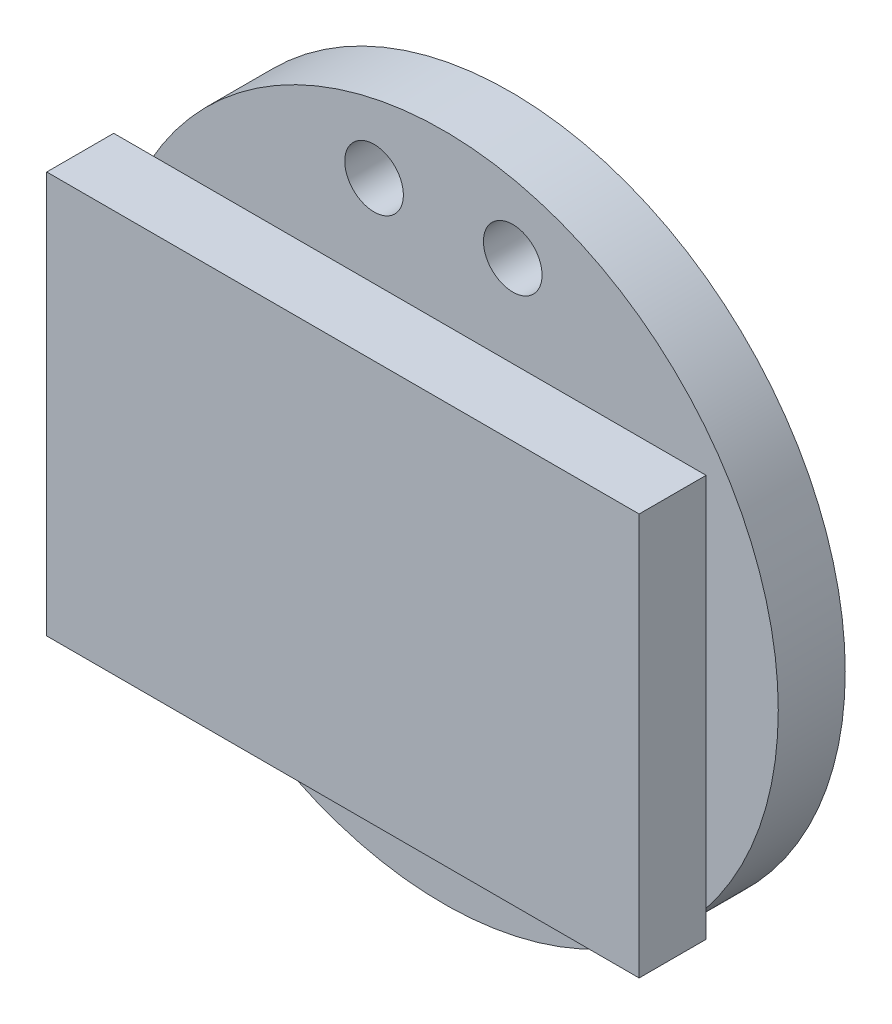
ISO-10303-21;
HEADER;
FILE_DESCRIPTION(('STEP AP214'),'2;1');
FILE_NAME('part.step','',(''),(''),'','','');
FILE_SCHEMA(('AUTOMOTIVE_DESIGN { 1 0 10303 214 1 1 1 1 }'));
ENDSEC;
DATA;
#1=APPLICATION_CONTEXT('core data for automotive mechanical design processes');
#2=APPLICATION_PROTOCOL_DEFINITION('international standard','automotive_design',2000,#1);
#3=PRODUCT_CONTEXT('',#1,'mechanical');
#4=PRODUCT('Part','Part','',(#3));
#5=PRODUCT_RELATED_PRODUCT_CATEGORY('part','',(#4));
#6=PRODUCT_DEFINITION_FORMATION('','',#4);
#7=PRODUCT_DEFINITION_CONTEXT('part definition',#1,'design');
#8=PRODUCT_DEFINITION('design','',#6,#7);
#9=PRODUCT_DEFINITION_SHAPE('','',#8);
#10=(LENGTH_UNIT() NAMED_UNIT(*) SI_UNIT(.MILLI.,.METRE.));
#11=(NAMED_UNIT(*) PLANE_ANGLE_UNIT() SI_UNIT($,.RADIAN.));
#12=(NAMED_UNIT(*) SI_UNIT($,.STERADIAN.) SOLID_ANGLE_UNIT());
#13=UNCERTAINTY_MEASURE_WITH_UNIT(LENGTH_MEASURE(1.E-05),#10,'distance_accuracy_value','');
#14=(GEOMETRIC_REPRESENTATION_CONTEXT(3) GLOBAL_UNCERTAINTY_ASSIGNED_CONTEXT((#13)) GLOBAL_UNIT_ASSIGNED_CONTEXT((#10,
#11,#12)) REPRESENTATION_CONTEXT('',''));
#15=CARTESIAN_POINT('',(0.,0.,0.));
#16=DIRECTION('',(0.,0.,1.));
#17=DIRECTION('',(1.,0.,0.));
#18=AXIS2_PLACEMENT_3D('',#15,#16,#17);
#19=CARTESIAN_POINT('',(0.,0.,-4.));
#20=DIRECTION('',(1.,0.,0.));
#21=DIRECTION('',(0.,0.,1.));
#22=AXIS2_PLACEMENT_3D('',#19,#20,#21);
#23=PLANE('',#22);
#24=DIRECTION('',(0.,-1.,0.));
#25=VECTOR('',#24,1.);
#26=CARTESIAN_POINT('',(0.,0.,0.));
#27=LINE('',#26,#25);
#28=CARTESIAN_POINT('',(0.,0.,0.));
#29=VERTEX_POINT('',#28);
#30=CARTESIAN_POINT('',(0.,-24.,0.));
#31=VERTEX_POINT('',#30);
#32=EDGE_CURVE('E103',#29,#31,#27,.T.);
#33=ORIENTED_EDGE('',*,*,#32,.F.);
#34=DIRECTION('',(0.,0.,1.));
#35=VECTOR('',#34,1.);
#36=CARTESIAN_POINT('',(0.,0.,-4.));
#37=LINE('',#36,#35);
#38=CARTESIAN_POINT('',(0.,0.,-4.));
#39=VERTEX_POINT('',#38);
#40=EDGE_CURVE('E102',#39,#29,#37,.T.);
#41=ORIENTED_EDGE('',*,*,#40,.F.);
#42=DIRECTION('',(0.,-1.,0.));
#43=VECTOR('',#42,1.);
#44=CARTESIAN_POINT('',(0.,0.,-4.));
#45=LINE('',#44,#43);
#46=CARTESIAN_POINT('',(0.,-24.,-4.));
#47=VERTEX_POINT('',#46);
#48=EDGE_CURVE('E97',#39,#47,#45,.T.);
#49=ORIENTED_EDGE('',*,*,#48,.T.);
#50=DIRECTION('',(0.,0.,1.));
#51=VECTOR('',#50,1.);
#52=CARTESIAN_POINT('',(0.,-24.,-4.));
#53=LINE('',#52,#51);
#54=EDGE_CURVE('E40',#47,#31,#53,.T.);
#55=ORIENTED_EDGE('',*,*,#54,.T.);
#56=EDGE_LOOP('',(#33,#41,#49,#55));
#57=FACE_BOUND('',#56,.T.);
#58=ADVANCED_FACE('F37',(#57),#23,.F.);
#59=CARTESIAN_POINT('',(0.,-24.,-4.));
#60=DIRECTION('',(0.,1.,0.));
#61=DIRECTION('',(0.,0.,-1.));
#62=AXIS2_PLACEMENT_3D('',#59,#60,#61);
#63=PLANE('',#62);
#64=DIRECTION('',(1.,0.,0.));
#65=VECTOR('',#64,1.);
#66=CARTESIAN_POINT('',(0.,-24.,0.));
#67=LINE('',#66,#65);
#68=CARTESIAN_POINT('',(35.38,-24.,0.));
#69=VERTEX_POINT('',#68);
#70=EDGE_CURVE('E105',#31,#69,#67,.T.);
#71=ORIENTED_EDGE('',*,*,#70,.F.);
#72=ORIENTED_EDGE('',*,*,#54,.F.);
#73=DIRECTION('',(1.,0.,0.));
#74=VECTOR('',#73,1.);
#75=CARTESIAN_POINT('',(0.,-24.,-4.));
#76=LINE('',#75,#74);
#77=CARTESIAN_POINT('',(35.38,-24.,-4.));
#78=VERTEX_POINT('',#77);
#79=EDGE_CURVE('E79',#47,#78,#76,.T.);
#80=ORIENTED_EDGE('',*,*,#79,.T.);
#81=DIRECTION('',(0.,0.,1.));
#82=VECTOR('',#81,1.);
#83=CARTESIAN_POINT('',(35.38,-24.,-4.));
#84=LINE('',#83,#82);
#85=EDGE_CURVE('E88',#78,#69,#84,.T.);
#86=ORIENTED_EDGE('',*,*,#85,.T.);
#87=EDGE_LOOP('',(#71,#72,#80,#86));
#88=FACE_BOUND('',#87,.T.);
#89=ADVANCED_FACE('F94',(#88),#63,.F.);
#90=CARTESIAN_POINT('',(35.38,0.,-4.));
#91=DIRECTION('',(-1.,0.,0.));
#92=DIRECTION('',(0.,-1.,0.));
#93=AXIS2_PLACEMENT_3D('',#90,#91,#92);
#94=PLANE('',#93);
#95=DIRECTION('',(0.,1.,0.));
#96=VECTOR('',#95,1.);
#97=CARTESIAN_POINT('',(35.38,0.,0.));
#98=LINE('',#97,#96);
#99=CARTESIAN_POINT('',(35.38,0.,0.));
#100=VERTEX_POINT('',#99);
#101=EDGE_CURVE('E90',#69,#100,#98,.T.);
#102=ORIENTED_EDGE('',*,*,#101,.F.);
#103=ORIENTED_EDGE('',*,*,#85,.F.);
#104=DIRECTION('',(0.,1.,0.));
#105=VECTOR('',#104,1.);
#106=CARTESIAN_POINT('',(35.38,0.,-4.));
#107=LINE('',#106,#105);
#108=CARTESIAN_POINT('',(35.38,0.,-4.));
#109=VERTEX_POINT('',#108);
#110=EDGE_CURVE('E82',#78,#109,#107,.T.);
#111=ORIENTED_EDGE('',*,*,#110,.T.);
#112=DIRECTION('',(0.,0.,1.));
#113=VECTOR('',#112,1.);
#114=CARTESIAN_POINT('',(35.38,0.,-4.));
#115=LINE('',#114,#113);
#116=EDGE_CURVE('E93',#109,#100,#115,.T.);
#117=ORIENTED_EDGE('',*,*,#116,.T.);
#118=EDGE_LOOP('',(#102,#103,#111,#117));
#119=FACE_BOUND('',#118,.T.);
#120=ADVANCED_FACE('F89',(#119),#94,.F.);
#121=CARTESIAN_POINT('',(0.,0.,-4.));
#122=DIRECTION('',(0.,-1.,0.));
#123=DIRECTION('',(0.,0.,1.));
#124=AXIS2_PLACEMENT_3D('',#121,#122,#123);
#125=PLANE('',#124);
#126=DIRECTION('',(-1.,0.,0.));
#127=VECTOR('',#126,1.);
#128=CARTESIAN_POINT('',(0.,0.,0.));
#129=LINE('',#128,#127);
#130=EDGE_CURVE('E68',#100,#29,#129,.T.);
#131=ORIENTED_EDGE('',*,*,#130,.F.);
#132=ORIENTED_EDGE('',*,*,#116,.F.);
#133=DIRECTION('',(-1.,0.,0.));
#134=VECTOR('',#133,1.);
#135=CARTESIAN_POINT('',(0.,0.,-4.));
#136=LINE('',#135,#134);
#137=EDGE_CURVE('E54',#109,#39,#136,.T.);
#138=ORIENTED_EDGE('',*,*,#137,.T.);
#139=ORIENTED_EDGE('',*,*,#40,.T.);
#140=EDGE_LOOP('',(#131,#132,#138,#139));
#141=FACE_BOUND('',#140,.T.);
#142=ADVANCED_FACE('F115',(#141),#125,.F.);
#143=CARTESIAN_POINT('',(0.,0.,-4.));
#144=DIRECTION('',(0.,0.,-1.));
#145=DIRECTION('',(1.,0.,0.));
#146=AXIS2_PLACEMENT_3D('',#143,#144,#145);
#147=PLANE('',#146);
#148=CARTESIAN_POINT('',(17.69,-12.,-4.));
#149=DIRECTION('',(0.,0.,1.));
#150=DIRECTION('',(1.,0.,0.));
#151=AXIS2_PLACEMENT_3D('',#148,#149,#150);
#152=CIRCLE('',#151,10.);
#153=CARTESIAN_POINT('',(27.69,-12.,-4.));
#154=VERTEX_POINT('',#153);
#155=EDGE_CURVE('E11',#154,#154,#152,.T.);
#156=ORIENTED_EDGE('',*,*,#155,.T.);
#157=EDGE_LOOP('',(#156));
#158=FACE_BOUND('',#157,.T.);
#159=ORIENTED_EDGE('',*,*,#48,.F.);
#160=ORIENTED_EDGE('',*,*,#137,.F.);
#161=ORIENTED_EDGE('',*,*,#110,.F.);
#162=ORIENTED_EDGE('',*,*,#79,.F.);
#163=EDGE_LOOP('',(#159,#160,#161,#162));
#164=FACE_BOUND('',#163,.T.);
#165=ADVANCED_FACE('F84',(#158,#164),#147,.T.);
#166=CARTESIAN_POINT('',(0.,0.,0.));
#167=DIRECTION('',(0.,0.,-1.));
#168=DIRECTION('',(1.,0.,0.));
#169=AXIS2_PLACEMENT_3D('',#166,#167,#168);
#170=PLANE('',#169);
#171=ORIENTED_EDGE('',*,*,#32,.T.);
#172=ORIENTED_EDGE('',*,*,#70,.T.);
#173=ORIENTED_EDGE('',*,*,#101,.T.);
#174=ORIENTED_EDGE('',*,*,#130,.T.);
#175=EDGE_LOOP('',(#171,#172,#173,#174));
#176=FACE_BOUND('',#175,.T.);
#177=ADVANCED_FACE('F111',(#176),#170,.F.);
#178=CARTESIAN_POINT('',(17.69,-12.,-6.));
#179=DIRECTION('',(0.,0.,1.));
#180=DIRECTION('',(-1.,0.,0.));
#181=AXIS2_PLACEMENT_3D('',#178,#179,#180);
#182=CYLINDRICAL_SURFACE('',#181,10.);
#183=CARTESIAN_POINT('',(17.69,-12.,-6.));
#184=DIRECTION('',(0.,0.,1.));
#185=DIRECTION('',(1.,0.,0.));
#186=AXIS2_PLACEMENT_3D('',#183,#184,#185);
#187=CIRCLE('',#186,10.);
#188=CARTESIAN_POINT('',(27.69,-12.,-6.));
#189=VERTEX_POINT('',#188);
#190=EDGE_CURVE('E106',#189,#189,#187,.T.);
#191=ORIENTED_EDGE('',*,*,#190,.T.);
#192=EDGE_LOOP('',(#191));
#193=FACE_BOUND('',#192,.T.);
#194=ORIENTED_EDGE('',*,*,#155,.F.);
#195=EDGE_LOOP('',(#194));
#196=FACE_BOUND('',#195,.T.);
#197=ADVANCED_FACE('F155',(#193,#196),#182,.T.);
#198=CARTESIAN_POINT('',(17.69,-12.,-10.));
#199=DIRECTION('',(0.,0.,1.));
#200=DIRECTION('',(-1.,0.,0.));
#201=AXIS2_PLACEMENT_3D('',#198,#199,#200);
#202=CYLINDRICAL_SURFACE('',#201,20.);
#203=CARTESIAN_POINT('',(17.69,-12.,-10.));
#204=DIRECTION('',(0.,0.,1.));
#205=DIRECTION('',(1.,0.,0.));
#206=AXIS2_PLACEMENT_3D('',#203,#204,#205);
#207=CIRCLE('',#206,20.);
#208=CARTESIAN_POINT('',(37.69,-12.,-10.));
#209=VERTEX_POINT('',#208);
#210=EDGE_CURVE('E265',#209,#209,#207,.T.);
#211=ORIENTED_EDGE('',*,*,#210,.T.);
#212=EDGE_LOOP('',(#211));
#213=FACE_BOUND('',#212,.T.);
#214=CARTESIAN_POINT('',(17.69,-12.,-6.));
#215=DIRECTION('',(0.,0.,1.));
#216=DIRECTION('',(1.,0.,0.));
#217=AXIS2_PLACEMENT_3D('',#214,#215,#216);
#218=CIRCLE('',#217,20.);
#219=CARTESIAN_POINT('',(37.69,-12.,-6.));
#220=VERTEX_POINT('',#219);
#221=EDGE_CURVE('E264',#220,#220,#218,.T.);
#222=ORIENTED_EDGE('',*,*,#221,.F.);
#223=EDGE_LOOP('',(#222));
#224=FACE_BOUND('',#223,.T.);
#225=ADVANCED_FACE('F163',(#213,#224),#202,.T.);
#226=CARTESIAN_POINT('',(17.69,-12.,-10.));
#227=DIRECTION('',(0.,0.,-1.));
#228=DIRECTION('',(1.,0.,0.));
#229=AXIS2_PLACEMENT_3D('',#226,#227,#228);
#230=PLANE('',#229);
#231=CARTESIAN_POINT('',(21.8311047216403,3.45481322062509,-10.));
#232=DIRECTION('',(0.,0.,1.));
#233=DIRECTION('',(1.,0.,0.));
#234=AXIS2_PLACEMENT_3D('',#231,#232,#233);
#235=CIRCLE('',#234,1.75);
#236=CARTESIAN_POINT('',(23.5811047216403,3.45481322062509,-10.));
#237=VERTEX_POINT('',#236);
#238=EDGE_CURVE('E240',#237,#237,#235,.T.);
#239=ORIENTED_EDGE('',*,*,#238,.T.);
#240=EDGE_LOOP('',(#239));
#241=FACE_BOUND('',#240,.T.);
#242=CARTESIAN_POINT('',(13.5488952783597,-27.4548132206251,-10.));
#243=DIRECTION('',(0.,0.,1.));
#244=DIRECTION('',(1.,0.,0.));
#245=AXIS2_PLACEMENT_3D('',#242,#243,#244);
#246=CIRCLE('',#245,1.75);
#247=CARTESIAN_POINT('',(15.2988952783597,-27.4548132206251,-10.));
#248=VERTEX_POINT('',#247);
#249=EDGE_CURVE('E260',#248,#248,#246,.T.);
#250=ORIENTED_EDGE('',*,*,#249,.T.);
#251=EDGE_LOOP('',(#250));
#252=FACE_BOUND('',#251,.T.);
#253=CARTESIAN_POINT('',(21.8311047216403,-27.4548132206251,-10.));
#254=DIRECTION('',(0.,0.,1.));
#255=DIRECTION('',(1.,0.,0.));
#256=AXIS2_PLACEMENT_3D('',#253,#254,#255);
#257=CIRCLE('',#256,1.75);
#258=CARTESIAN_POINT('',(23.5811047216403,-27.4548132206251,-10.));
#259=VERTEX_POINT('',#258);
#260=EDGE_CURVE('E257',#259,#259,#257,.T.);
#261=ORIENTED_EDGE('',*,*,#260,.T.);
#262=EDGE_LOOP('',(#261));
#263=FACE_BOUND('',#262,.T.);
#264=CARTESIAN_POINT('',(13.5488952783597,3.45481322062509,-10.));
#265=DIRECTION('',(0.,0.,1.));
#266=DIRECTION('',(1.,0.,0.));
#267=AXIS2_PLACEMENT_3D('',#264,#265,#266);
#268=CIRCLE('',#267,1.75);
#269=CARTESIAN_POINT('',(15.2988952783597,3.45481322062509,-10.));
#270=VERTEX_POINT('',#269);
#271=EDGE_CURVE('E248',#270,#270,#268,.T.);
#272=ORIENTED_EDGE('',*,*,#271,.T.);
#273=EDGE_LOOP('',(#272));
#274=FACE_BOUND('',#273,.T.);
#275=ORIENTED_EDGE('',*,*,#210,.F.);
#276=EDGE_LOOP('',(#275));
#277=FACE_BOUND('',#276,.T.);
#278=ADVANCED_FACE('F173',(#241,#252,#263,#274,#277),#230,.T.);
#279=CARTESIAN_POINT('',(17.69,-12.,-6.));
#280=DIRECTION('',(0.,0.,-1.));
#281=DIRECTION('',(1.,0.,0.));
#282=AXIS2_PLACEMENT_3D('',#279,#280,#281);
#283=PLANE('',#282);
#284=CARTESIAN_POINT('',(21.8311047216403,3.45481322062509,-6.));
#285=DIRECTION('',(0.,0.,-1.));
#286=DIRECTION('',(1.,0.,0.));
#287=AXIS2_PLACEMENT_3D('',#284,#285,#286);
#288=CIRCLE('',#287,1.75);
#289=CARTESIAN_POINT('',(23.5811047216403,3.45481322062509,-6.));
#290=VERTEX_POINT('',#289);
#291=EDGE_CURVE('E243',#290,#290,#288,.T.);
#292=ORIENTED_EDGE('',*,*,#291,.T.);
#293=EDGE_LOOP('',(#292));
#294=FACE_BOUND('',#293,.T.);
#295=CARTESIAN_POINT('',(13.5488952783597,-27.4548132206251,-6.));
#296=DIRECTION('',(0.,0.,-1.));
#297=DIRECTION('',(1.,0.,0.));
#298=AXIS2_PLACEMENT_3D('',#295,#296,#297);
#299=CIRCLE('',#298,1.75);
#300=CARTESIAN_POINT('',(15.2988952783597,-27.4548132206251,-6.));
#301=VERTEX_POINT('',#300);
#302=EDGE_CURVE('E245',#301,#301,#299,.T.);
#303=ORIENTED_EDGE('',*,*,#302,.T.);
#304=EDGE_LOOP('',(#303));
#305=FACE_BOUND('',#304,.T.);
#306=CARTESIAN_POINT('',(21.8311047216403,-27.4548132206251,-6.));
#307=DIRECTION('',(0.,0.,-1.));
#308=DIRECTION('',(-1.,0.,0.));
#309=AXIS2_PLACEMENT_3D('',#306,#307,#308);
#310=CIRCLE('',#309,1.75);
#311=CARTESIAN_POINT('',(20.0811047216404,-27.4548132206251,-6.));
#312=VERTEX_POINT('',#311);
#313=EDGE_CURVE('E251',#312,#312,#310,.T.);
#314=ORIENTED_EDGE('',*,*,#313,.T.);
#315=EDGE_LOOP('',(#314));
#316=FACE_BOUND('',#315,.T.);
#317=CARTESIAN_POINT('',(13.5488952783597,3.45481322062509,-6.));
#318=DIRECTION('',(0.,0.,-1.));
#319=DIRECTION('',(-1.,0.,0.));
#320=AXIS2_PLACEMENT_3D('',#317,#318,#319);
#321=CIRCLE('',#320,1.75);
#322=CARTESIAN_POINT('',(11.7988952783597,3.45481322062509,-6.));
#323=VERTEX_POINT('',#322);
#324=EDGE_CURVE('E244',#323,#323,#321,.T.);
#325=ORIENTED_EDGE('',*,*,#324,.T.);
#326=EDGE_LOOP('',(#325));
#327=FACE_BOUND('',#326,.T.);
#328=ORIENTED_EDGE('',*,*,#190,.F.);
#329=EDGE_LOOP('',(#328));
#330=FACE_BOUND('',#329,.T.);
#331=ORIENTED_EDGE('',*,*,#221,.T.);
#332=EDGE_LOOP('',(#331));
#333=FACE_BOUND('',#332,.T.);
#334=ADVANCED_FACE('F183',(#294,#305,#316,#327,#330,#333),#283,.F.);
#335=CARTESIAN_POINT('',(13.5488952783597,3.45481322062509,-16.));
#336=DIRECTION('',(0.,0.,1.));
#337=DIRECTION('',(-1.,0.,0.));
#338=AXIS2_PLACEMENT_3D('',#335,#336,#337);
#339=CYLINDRICAL_SURFACE('',#338,1.75);
#340=ORIENTED_EDGE('',*,*,#271,.F.);
#341=EDGE_LOOP('',(#340));
#342=FACE_BOUND('',#341,.T.);
#343=ORIENTED_EDGE('',*,*,#324,.F.);
#344=EDGE_LOOP('',(#343));
#345=FACE_BOUND('',#344,.T.);
#346=ADVANCED_FACE('F193',(#342,#345),#339,.F.);
#347=CARTESIAN_POINT('',(21.8311047216403,-27.4548132206251,-16.));
#348=DIRECTION('',(0.,0.,1.));
#349=DIRECTION('',(-1.,0.,0.));
#350=AXIS2_PLACEMENT_3D('',#347,#348,#349);
#351=CYLINDRICAL_SURFACE('',#350,1.75);
#352=ORIENTED_EDGE('',*,*,#260,.F.);
#353=EDGE_LOOP('',(#352));
#354=FACE_BOUND('',#353,.T.);
#355=ORIENTED_EDGE('',*,*,#313,.F.);
#356=EDGE_LOOP('',(#355));
#357=FACE_BOUND('',#356,.T.);
#358=ADVANCED_FACE('F203',(#354,#357),#351,.F.);
#359=CARTESIAN_POINT('',(13.5488952783597,-27.4548132206251,-16.));
#360=DIRECTION('',(0.,0.,1.));
#361=DIRECTION('',(-1.,0.,0.));
#362=AXIS2_PLACEMENT_3D('',#359,#360,#361);
#363=CYLINDRICAL_SURFACE('',#362,1.75);
#364=ORIENTED_EDGE('',*,*,#249,.F.);
#365=EDGE_LOOP('',(#364));
#366=FACE_BOUND('',#365,.T.);
#367=ORIENTED_EDGE('',*,*,#302,.F.);
#368=EDGE_LOOP('',(#367));
#369=FACE_BOUND('',#368,.T.);
#370=ADVANCED_FACE('F213',(#366,#369),#363,.F.);
#371=CARTESIAN_POINT('',(21.8311047216403,3.45481322062509,-16.));
#372=DIRECTION('',(0.,0.,1.));
#373=DIRECTION('',(-1.,0.,0.));
#374=AXIS2_PLACEMENT_3D('',#371,#372,#373);
#375=CYLINDRICAL_SURFACE('',#374,1.75);
#376=ORIENTED_EDGE('',*,*,#238,.F.);
#377=EDGE_LOOP('',(#376));
#378=FACE_BOUND('',#377,.T.);
#379=ORIENTED_EDGE('',*,*,#291,.F.);
#380=EDGE_LOOP('',(#379));
#381=FACE_BOUND('',#380,.T.);
#382=ADVANCED_FACE('F223',(#378,#381),#375,.F.);
#383=CLOSED_SHELL('',(#58,#89,#120,#142,#165,#177,#197,#225,#278,#334,#346,#358,#370,#382));
#384=MANIFOLD_SOLID_BREP('B2',#383);
#385=ADVANCED_BREP_SHAPE_REPRESENTATION('',(#18,#384),#14);
#386=SHAPE_DEFINITION_REPRESENTATION(#9,#385);
ENDSEC;
END-ISO-10303-21;
